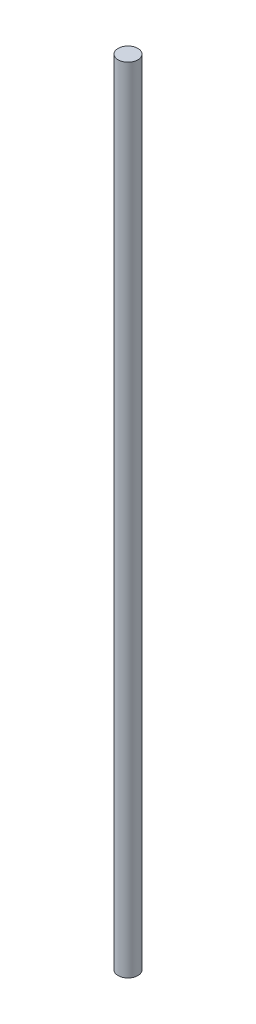
ISO-10303-21;
HEADER;
FILE_DESCRIPTION(('STEP AP214'),'2;1');
FILE_NAME('part.step','',(''),(''),'','','');
FILE_SCHEMA(('AUTOMOTIVE_DESIGN { 1 0 10303 214 1 1 1 1 }'));
ENDSEC;
DATA;
#1=APPLICATION_CONTEXT('core data for automotive mechanical design processes');
#2=APPLICATION_PROTOCOL_DEFINITION('international standard','automotive_design',2000,#1);
#3=PRODUCT_CONTEXT('',#1,'mechanical');
#4=PRODUCT('Part','Part','',(#3));
#5=PRODUCT_RELATED_PRODUCT_CATEGORY('part','',(#4));
#6=PRODUCT_DEFINITION_FORMATION('','',#4);
#7=PRODUCT_DEFINITION_CONTEXT('part definition',#1,'design');
#8=PRODUCT_DEFINITION('design','',#6,#7);
#9=PRODUCT_DEFINITION_SHAPE('','',#8);
#10=(LENGTH_UNIT() NAMED_UNIT(*) SI_UNIT(.MILLI.,.METRE.));
#11=(NAMED_UNIT(*) PLANE_ANGLE_UNIT() SI_UNIT($,.RADIAN.));
#12=(NAMED_UNIT(*) SI_UNIT($,.STERADIAN.) SOLID_ANGLE_UNIT());
#13=UNCERTAINTY_MEASURE_WITH_UNIT(LENGTH_MEASURE(1.E-05),#10,'distance_accuracy_value','');
#14=(GEOMETRIC_REPRESENTATION_CONTEXT(3) GLOBAL_UNCERTAINTY_ASSIGNED_CONTEXT((#13)) GLOBAL_UNIT_ASSIGNED_CONTEXT((#10,
#11,#12)) REPRESENTATION_CONTEXT('',''));
#15=CARTESIAN_POINT('',(0.,0.,0.));
#16=DIRECTION('',(0.,0.,1.));
#17=DIRECTION('',(1.,0.,0.));
#18=AXIS2_PLACEMENT_3D('',#15,#16,#17);
#19=CARTESIAN_POINT('',(0.,120.,0.));
#20=DIRECTION('',(0.,-1.,0.));
#21=DIRECTION('',(0.,0.,-1.));
#22=AXIS2_PLACEMENT_3D('',#19,#20,#21);
#23=CYLINDRICAL_SURFACE('',#22,1.5);
#24=CARTESIAN_POINT('',(0.,120.,0.));
#25=DIRECTION('',(0.,1.,0.));
#26=DIRECTION('',(0.,0.,1.));
#27=AXIS2_PLACEMENT_3D('',#24,#25,#26);
#28=CIRCLE('',#27,1.5);
#29=CARTESIAN_POINT('',(0.,120.,1.5));
#30=VERTEX_POINT('',#29);
#31=EDGE_CURVE('E10',#30,#30,#28,.T.);
#32=ORIENTED_EDGE('',*,*,#31,.F.);
#33=EDGE_LOOP('',(#32));
#34=FACE_BOUND('',#33,.T.);
#35=CARTESIAN_POINT('',(0.,0.,0.));
#36=DIRECTION('',(0.,1.,0.));
#37=DIRECTION('',(0.,0.,1.));
#38=AXIS2_PLACEMENT_3D('',#35,#36,#37);
#39=CIRCLE('',#38,1.5);
#40=CARTESIAN_POINT('',(0.,0.,1.5));
#41=VERTEX_POINT('',#40);
#42=EDGE_CURVE('E46',#41,#41,#39,.T.);
#43=ORIENTED_EDGE('',*,*,#42,.T.);
#44=EDGE_LOOP('',(#43));
#45=FACE_BOUND('',#44,.T.);
#46=ADVANCED_FACE('F43',(#34,#45),#23,.T.);
#47=CARTESIAN_POINT('',(0.,120.,0.));
#48=DIRECTION('',(0.,1.,0.));
#49=DIRECTION('',(0.,0.,1.));
#50=AXIS2_PLACEMENT_3D('',#47,#48,#49);
#51=PLANE('',#50);
#52=ORIENTED_EDGE('',*,*,#31,.T.);
#53=EDGE_LOOP('',(#52));
#54=FACE_BOUND('',#53,.T.);
#55=ADVANCED_FACE('F60',(#54),#51,.T.);
#56=CARTESIAN_POINT('',(0.,0.,0.));
#57=DIRECTION('',(0.,1.,0.));
#58=DIRECTION('',(0.,0.,1.));
#59=AXIS2_PLACEMENT_3D('',#56,#57,#58);
#60=PLANE('',#59);
#61=ORIENTED_EDGE('',*,*,#42,.F.);
#62=EDGE_LOOP('',(#61));
#63=FACE_BOUND('',#62,.T.);
#64=ADVANCED_FACE('F58',(#63),#60,.F.);
#65=CLOSED_SHELL('',(#46,#55,#64));
#66=MANIFOLD_SOLID_BREP('B2',#65);
#67=ADVANCED_BREP_SHAPE_REPRESENTATION('',(#18,#66),#14);
#68=SHAPE_DEFINITION_REPRESENTATION(#9,#67);
ENDSEC;
END-ISO-10303-21;
